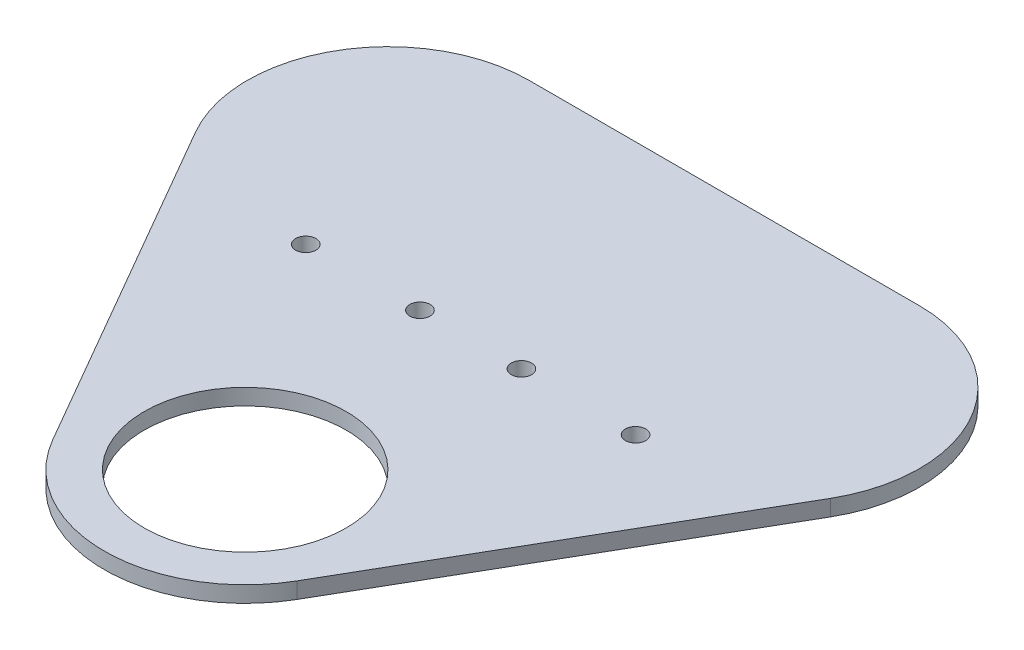
ISO-10303-21;
HEADER;
FILE_DESCRIPTION(('STEP AP214'),'2;1');
FILE_NAME('part.step','',(''),(''),'','','');
FILE_SCHEMA(('AUTOMOTIVE_DESIGN { 1 0 10303 214 1 1 1 1 }'));
ENDSEC;
DATA;
#1=APPLICATION_CONTEXT('core data for automotive mechanical design processes');
#2=APPLICATION_PROTOCOL_DEFINITION('international standard','automotive_design',2000,#1);
#3=PRODUCT_CONTEXT('',#1,'mechanical');
#4=PRODUCT('Part','Part','',(#3));
#5=PRODUCT_RELATED_PRODUCT_CATEGORY('part','',(#4));
#6=PRODUCT_DEFINITION_FORMATION('','',#4);
#7=PRODUCT_DEFINITION_CONTEXT('part definition',#1,'design');
#8=PRODUCT_DEFINITION('design','',#6,#7);
#9=PRODUCT_DEFINITION_SHAPE('','',#8);
#10=(LENGTH_UNIT() NAMED_UNIT(*) SI_UNIT(.MILLI.,.METRE.));
#11=(NAMED_UNIT(*) PLANE_ANGLE_UNIT() SI_UNIT($,.RADIAN.));
#12=(NAMED_UNIT(*) SI_UNIT($,.STERADIAN.) SOLID_ANGLE_UNIT());
#13=UNCERTAINTY_MEASURE_WITH_UNIT(LENGTH_MEASURE(1.E-05),#10,'distance_accuracy_value','');
#14=(GEOMETRIC_REPRESENTATION_CONTEXT(3) GLOBAL_UNCERTAINTY_ASSIGNED_CONTEXT((#13)) GLOBAL_UNIT_ASSIGNED_CONTEXT((#10,
#11,#12)) REPRESENTATION_CONTEXT('',''));
#15=CARTESIAN_POINT('',(0.,0.,0.));
#16=DIRECTION('',(0.,0.,1.));
#17=DIRECTION('',(1.,0.,0.));
#18=AXIS2_PLACEMENT_3D('',#15,#16,#17);
#19=CARTESIAN_POINT('',(86.6025403784437,3.175,-55.0549417933341));
#20=DIRECTION('',(-0.866025403784439,0.,-0.499999999999999));
#21=DIRECTION('',(-0.499999999999999,0.,0.866025403784439));
#22=AXIS2_PLACEMENT_3D('',#19,#20,#21);
#23=PLANE('',#22);
#24=DIRECTION('',(0.499999999999999,0.,-0.866025403784439));
#25=VECTOR('',#24,1.);
#26=CARTESIAN_POINT('',(86.6025403784437,0.,-55.0549417933341));
#27=LINE('',#26,#25);
#28=CARTESIAN_POINT('',(24.0581857171318,0.,53.2750582066658));
#29=VERTEX_POINT('',#28);
#30=CARTESIAN_POINT('',(62.5443546613121,0.,-13.3849417933341));
#31=VERTEX_POINT('',#30);
#32=EDGE_CURVE('E123',#29,#31,#27,.T.);
#33=ORIENTED_EDGE('',*,*,#32,.T.);
#34=DIRECTION('',(0.,-1.,0.));
#35=VECTOR('',#34,1.);
#36=CARTESIAN_POINT('',(62.5443546613121,3.175,-13.3849417933341));
#37=LINE('',#36,#35);
#38=CARTESIAN_POINT('',(62.5443546613121,3.175,-13.3849417933341));
#39=VERTEX_POINT('',#38);
#40=EDGE_CURVE('E99',#31,#39,#37,.F.);
#41=ORIENTED_EDGE('',*,*,#40,.T.);
#42=DIRECTION('',(0.499999999999999,0.,-0.866025403784439));
#43=VECTOR('',#42,1.);
#44=CARTESIAN_POINT('',(86.6025403784437,3.175,-55.0549417933341));
#45=LINE('',#44,#43);
#46=CARTESIAN_POINT('',(24.0581857171318,3.175,53.2750582066658));
#47=VERTEX_POINT('',#46);
#48=EDGE_CURVE('E127',#47,#39,#45,.T.);
#49=ORIENTED_EDGE('',*,*,#48,.F.);
#50=DIRECTION('',(0.,-1.,0.));
#51=VECTOR('',#50,1.);
#52=CARTESIAN_POINT('',(24.0581857171318,3.175,53.2750582066658));
#53=LINE('',#52,#51);
#54=EDGE_CURVE('E105',#47,#29,#53,.T.);
#55=ORIENTED_EDGE('',*,*,#54,.T.);
#56=EDGE_LOOP('',(#33,#41,#49,#55));
#57=FACE_BOUND('',#56,.T.);
#58=ADVANCED_FACE('F39',(#57),#23,.F.);
#59=CARTESIAN_POINT('',(-86.6025403784438,3.175,-55.0549417933341));
#60=DIRECTION('',(0.,0.,1.));
#61=DIRECTION('',(1.,0.,0.));
#62=AXIS2_PLACEMENT_3D('',#59,#60,#61);
#63=PLANE('',#62);
#64=DIRECTION('',(-1.,0.,0.));
#65=VECTOR('',#64,1.);
#66=CARTESIAN_POINT('',(-86.6025403784438,3.175,-55.0549417933341));
#67=LINE('',#66,#65);
#68=CARTESIAN_POINT('',(38.4861689441804,3.175,-55.0549417933341));
#69=VERTEX_POINT('',#68);
#70=CARTESIAN_POINT('',(-38.4861689441804,3.175,-55.0549417933341));
#71=VERTEX_POINT('',#70);
#72=EDGE_CURVE('E114',#69,#71,#67,.T.);
#73=ORIENTED_EDGE('',*,*,#72,.F.);
#74=DIRECTION('',(0.,-1.,0.));
#75=VECTOR('',#74,1.);
#76=CARTESIAN_POINT('',(38.4861689441804,3.175,-55.0549417933341));
#77=LINE('',#76,#75);
#78=CARTESIAN_POINT('',(38.4861689441804,0.,-55.0549417933341));
#79=VERTEX_POINT('',#78);
#80=EDGE_CURVE('E98',#69,#79,#77,.T.);
#81=ORIENTED_EDGE('',*,*,#80,.T.);
#82=DIRECTION('',(-1.,0.,0.));
#83=VECTOR('',#82,1.);
#84=CARTESIAN_POINT('',(-86.6025403784438,0.,-55.0549417933341));
#85=LINE('',#84,#83);
#86=CARTESIAN_POINT('',(-38.4861689441804,0.,-55.0549417933341));
#87=VERTEX_POINT('',#86);
#88=EDGE_CURVE('E112',#79,#87,#85,.T.);
#89=ORIENTED_EDGE('',*,*,#88,.T.);
#90=DIRECTION('',(0.,-1.,0.));
#91=VECTOR('',#90,1.);
#92=CARTESIAN_POINT('',(-38.4861689441804,3.175,-55.0549417933341));
#93=LINE('',#92,#91);
#94=EDGE_CURVE('E117',#87,#71,#93,.F.);
#95=ORIENTED_EDGE('',*,*,#94,.T.);
#96=EDGE_LOOP('',(#73,#81,#89,#95));
#97=FACE_BOUND('',#96,.T.);
#98=ADVANCED_FACE('F111',(#97),#63,.F.);
#99=CARTESIAN_POINT('',(0.,3.175,94.9450582066659));
#100=DIRECTION('',(0.866025403784439,0.,-0.5));
#101=DIRECTION('',(-0.5,0.,-0.866025403784439));
#102=AXIS2_PLACEMENT_3D('',#99,#100,#101);
#103=PLANE('',#102);
#104=DIRECTION('',(0.5,0.,0.866025403784439));
#105=VECTOR('',#104,1.);
#106=CARTESIAN_POINT('',(0.,3.175,94.9450582066659));
#107=LINE('',#106,#105);
#108=CARTESIAN_POINT('',(-62.5443546613121,3.175,-13.3849417933341));
#109=VERTEX_POINT('',#108);
#110=CARTESIAN_POINT('',(-24.0581857171317,3.175,53.2750582066658));
#111=VERTEX_POINT('',#110);
#112=EDGE_CURVE('E134',#109,#111,#107,.T.);
#113=ORIENTED_EDGE('',*,*,#112,.F.);
#114=DIRECTION('',(0.,-1.,0.));
#115=VECTOR('',#114,1.);
#116=CARTESIAN_POINT('',(-62.5443546613121,3.175,-13.3849417933341));
#117=LINE('',#116,#115);
#118=CARTESIAN_POINT('',(-62.5443546613121,0.,-13.3849417933341));
#119=VERTEX_POINT('',#118);
#120=EDGE_CURVE('E11',#109,#119,#117,.T.);
#121=ORIENTED_EDGE('',*,*,#120,.T.);
#122=DIRECTION('',(0.5,0.,0.866025403784439));
#123=VECTOR('',#122,1.);
#124=CARTESIAN_POINT('',(0.,0.,94.9450582066659));
#125=LINE('',#124,#123);
#126=CARTESIAN_POINT('',(-24.0581857171317,0.,53.2750582066658));
#127=VERTEX_POINT('',#126);
#128=EDGE_CURVE('E122',#119,#127,#125,.T.);
#129=ORIENTED_EDGE('',*,*,#128,.T.);
#130=DIRECTION('',(0.,-1.,0.));
#131=VECTOR('',#130,1.);
#132=CARTESIAN_POINT('',(-24.0581857171317,3.175,53.2750582066658));
#133=LINE('',#132,#131);
#134=EDGE_CURVE('E48',#127,#111,#133,.F.);
#135=ORIENTED_EDGE('',*,*,#134,.T.);
#136=EDGE_LOOP('',(#113,#121,#129,#135));
#137=FACE_BOUND('',#136,.T.);
#138=ADVANCED_FACE('F213',(#137),#103,.F.);
#139=CARTESIAN_POINT('',(0.,3.175,0.));
#140=DIRECTION('',(0.,-1.,0.));
#141=DIRECTION('',(0.,0.,-1.));
#142=AXIS2_PLACEMENT_3D('',#139,#140,#141);
#143=PLANE('',#142);
#144=CARTESIAN_POINT('',(0.,3.175,39.3850582066658));
#145=DIRECTION('',(0.,1.,0.));
#146=DIRECTION('',(0.,0.,1.));
#147=AXIS2_PLACEMENT_3D('',#144,#145,#146);
#148=CIRCLE('',#147,19.9);
#149=CARTESIAN_POINT('',(0.,3.175,59.2850582066658));
#150=VERTEX_POINT('',#149);
#151=EDGE_CURVE('E193',#150,#150,#148,.T.);
#152=ORIENTED_EDGE('',*,*,#151,.F.);
#153=EDGE_LOOP('',(#152));
#154=FACE_BOUND('',#153,.T.);
#155=CARTESIAN_POINT('',(32.5,3.175,-5.0549417933341));
#156=DIRECTION('',(0.,1.,0.));
#157=DIRECTION('',(0.,0.,1.));
#158=AXIS2_PLACEMENT_3D('',#155,#156,#157);
#159=CIRCLE('',#158,2.);
#160=CARTESIAN_POINT('',(32.5,3.175,-3.0549417933341));
#161=VERTEX_POINT('',#160);
#162=EDGE_CURVE('E186',#161,#161,#159,.T.);
#163=ORIENTED_EDGE('',*,*,#162,.F.);
#164=EDGE_LOOP('',(#163));
#165=FACE_BOUND('',#164,.T.);
#166=CARTESIAN_POINT('',(-32.5,3.175,-5.0549417933341));
#167=DIRECTION('',(0.,1.,0.));
#168=DIRECTION('',(0.,0.,1.));
#169=AXIS2_PLACEMENT_3D('',#166,#167,#168);
#170=CIRCLE('',#169,2.);
#171=CARTESIAN_POINT('',(-32.5,3.175,-3.0549417933341));
#172=VERTEX_POINT('',#171);
#173=EDGE_CURVE('E178',#172,#172,#170,.T.);
#174=ORIENTED_EDGE('',*,*,#173,.F.);
#175=EDGE_LOOP('',(#174));
#176=FACE_BOUND('',#175,.T.);
#177=CARTESIAN_POINT('',(-10.,3.175,-5.0549417933341));
#178=DIRECTION('',(0.,1.,0.));
#179=DIRECTION('',(0.,0.,1.));
#180=AXIS2_PLACEMENT_3D('',#177,#178,#179);
#181=CIRCLE('',#180,2.);
#182=CARTESIAN_POINT('',(-10.,3.175,-3.0549417933341));
#183=VERTEX_POINT('',#182);
#184=EDGE_CURVE('E170',#183,#183,#181,.T.);
#185=ORIENTED_EDGE('',*,*,#184,.F.);
#186=EDGE_LOOP('',(#185));
#187=FACE_BOUND('',#186,.T.);
#188=CARTESIAN_POINT('',(10.,3.175,-5.0549417933341));
#189=DIRECTION('',(0.,1.,0.));
#190=DIRECTION('',(0.,0.,1.));
#191=AXIS2_PLACEMENT_3D('',#188,#189,#190);
#192=CIRCLE('',#191,2.);
#193=CARTESIAN_POINT('',(10.,3.175,-3.0549417933341));
#194=VERTEX_POINT('',#193);
#195=EDGE_CURVE('E161',#194,#194,#192,.T.);
#196=ORIENTED_EDGE('',*,*,#195,.F.);
#197=EDGE_LOOP('',(#196));
#198=FACE_BOUND('',#197,.T.);
#199=ORIENTED_EDGE('',*,*,#48,.T.);
#200=CARTESIAN_POINT('',(38.4861689441804,3.175,-27.2749417933341));
#201=DIRECTION('',(0.,-1.,0.));
#202=DIRECTION('',(0.,0.,-1.));
#203=AXIS2_PLACEMENT_3D('',#200,#201,#202);
#204=CIRCLE('',#203,27.78);
#205=EDGE_CURVE('E150',#39,#69,#204,.F.);
#206=ORIENTED_EDGE('',*,*,#205,.T.);
#207=ORIENTED_EDGE('',*,*,#72,.T.);
#208=CARTESIAN_POINT('',(-38.4861689441804,3.175,-27.2749417933341));
#209=DIRECTION('',(0.,-1.,0.));
#210=DIRECTION('',(0.,0.,-1.));
#211=AXIS2_PLACEMENT_3D('',#208,#209,#210);
#212=CIRCLE('',#211,27.78);
#213=EDGE_CURVE('E61',#71,#109,#212,.F.);
#214=ORIENTED_EDGE('',*,*,#213,.T.);
#215=ORIENTED_EDGE('',*,*,#112,.T.);
#216=CARTESIAN_POINT('',(0.,3.175,39.3850582066658));
#217=DIRECTION('',(0.,-1.,0.));
#218=DIRECTION('',(0.,0.,-1.));
#219=AXIS2_PLACEMENT_3D('',#216,#217,#218);
#220=CIRCLE('',#219,27.78);
#221=EDGE_CURVE('E145',#111,#47,#220,.F.);
#222=ORIENTED_EDGE('',*,*,#221,.T.);
#223=EDGE_LOOP('',(#199,#206,#207,#214,#215,#222));
#224=FACE_BOUND('',#223,.T.);
#225=ADVANCED_FACE('F210',(#154,#165,#176,#187,#198,#224),#143,.F.);
#226=CARTESIAN_POINT('',(0.,0.,0.));
#227=DIRECTION('',(0.,-1.,0.));
#228=DIRECTION('',(0.,0.,-1.));
#229=AXIS2_PLACEMENT_3D('',#226,#227,#228);
#230=PLANE('',#229);
#231=CARTESIAN_POINT('',(0.,0.,39.3850582066658));
#232=DIRECTION('',(0.,1.,0.));
#233=DIRECTION('',(0.,0.,1.));
#234=AXIS2_PLACEMENT_3D('',#231,#232,#233);
#235=CIRCLE('',#234,19.9);
#236=CARTESIAN_POINT('',(0.,0.,59.2850582066658));
#237=VERTEX_POINT('',#236);
#238=EDGE_CURVE('E166',#237,#237,#235,.T.);
#239=ORIENTED_EDGE('',*,*,#238,.T.);
#240=EDGE_LOOP('',(#239));
#241=FACE_BOUND('',#240,.T.);
#242=CARTESIAN_POINT('',(32.5,0.,-5.0549417933341));
#243=DIRECTION('',(0.,1.,0.));
#244=DIRECTION('',(0.,0.,1.));
#245=AXIS2_PLACEMENT_3D('',#242,#243,#244);
#246=CIRCLE('',#245,2.);
#247=CARTESIAN_POINT('',(32.5,0.,-3.0549417933341));
#248=VERTEX_POINT('',#247);
#249=EDGE_CURVE('E129',#248,#248,#246,.T.);
#250=ORIENTED_EDGE('',*,*,#249,.T.);
#251=EDGE_LOOP('',(#250));
#252=FACE_BOUND('',#251,.T.);
#253=CARTESIAN_POINT('',(-32.5,0.,-5.0549417933341));
#254=DIRECTION('',(0.,1.,0.));
#255=DIRECTION('',(0.,0.,1.));
#256=AXIS2_PLACEMENT_3D('',#253,#254,#255);
#257=CIRCLE('',#256,2.);
#258=CARTESIAN_POINT('',(-32.5,0.,-3.0549417933341));
#259=VERTEX_POINT('',#258);
#260=EDGE_CURVE('E182',#259,#259,#257,.T.);
#261=ORIENTED_EDGE('',*,*,#260,.T.);
#262=EDGE_LOOP('',(#261));
#263=FACE_BOUND('',#262,.T.);
#264=CARTESIAN_POINT('',(-10.,0.,-5.0549417933341));
#265=DIRECTION('',(0.,1.,0.));
#266=DIRECTION('',(0.,0.,1.));
#267=AXIS2_PLACEMENT_3D('',#264,#265,#266);
#268=CIRCLE('',#267,2.);
#269=CARTESIAN_POINT('',(-10.,0.,-3.0549417933341));
#270=VERTEX_POINT('',#269);
#271=EDGE_CURVE('E174',#270,#270,#268,.T.);
#272=ORIENTED_EDGE('',*,*,#271,.T.);
#273=EDGE_LOOP('',(#272));
#274=FACE_BOUND('',#273,.T.);
#275=CARTESIAN_POINT('',(10.,0.,-5.0549417933341));
#276=DIRECTION('',(0.,1.,0.));
#277=DIRECTION('',(0.,0.,1.));
#278=AXIS2_PLACEMENT_3D('',#275,#276,#277);
#279=CIRCLE('',#278,2.);
#280=CARTESIAN_POINT('',(10.,0.,-3.0549417933341));
#281=VERTEX_POINT('',#280);
#282=EDGE_CURVE('E165',#281,#281,#279,.T.);
#283=ORIENTED_EDGE('',*,*,#282,.T.);
#284=EDGE_LOOP('',(#283));
#285=FACE_BOUND('',#284,.T.);
#286=ORIENTED_EDGE('',*,*,#88,.F.);
#287=CARTESIAN_POINT('',(38.4861689441804,0.,-27.2749417933341));
#288=DIRECTION('',(0.,-1.,0.));
#289=DIRECTION('',(0.,0.,-1.));
#290=AXIS2_PLACEMENT_3D('',#287,#288,#289);
#291=CIRCLE('',#290,27.78);
#292=EDGE_CURVE('E94',#79,#31,#291,.T.);
#293=ORIENTED_EDGE('',*,*,#292,.T.);
#294=ORIENTED_EDGE('',*,*,#32,.F.);
#295=CARTESIAN_POINT('',(0.,0.,39.3850582066658));
#296=DIRECTION('',(0.,-1.,0.));
#297=DIRECTION('',(0.,0.,-1.));
#298=AXIS2_PLACEMENT_3D('',#295,#296,#297);
#299=CIRCLE('',#298,27.78);
#300=EDGE_CURVE('E116',#29,#127,#299,.T.);
#301=ORIENTED_EDGE('',*,*,#300,.T.);
#302=ORIENTED_EDGE('',*,*,#128,.F.);
#303=CARTESIAN_POINT('',(-38.4861689441804,0.,-27.2749417933341));
#304=DIRECTION('',(0.,-1.,0.));
#305=DIRECTION('',(0.,0.,-1.));
#306=AXIS2_PLACEMENT_3D('',#303,#304,#305);
#307=CIRCLE('',#306,27.78);
#308=EDGE_CURVE('E106',#119,#87,#307,.T.);
#309=ORIENTED_EDGE('',*,*,#308,.T.);
#310=EDGE_LOOP('',(#286,#293,#294,#301,#302,#309));
#311=FACE_BOUND('',#310,.T.);
#312=ADVANCED_FACE('F119',(#241,#252,#263,#274,#285,#311),#230,.T.);
#313=CARTESIAN_POINT('',(38.4861689441804,3.175,-27.2749417933341));
#314=DIRECTION('',(0.,-1.,0.));
#315=DIRECTION('',(0.,0.,-1.));
#316=AXIS2_PLACEMENT_3D('',#313,#314,#315);
#317=CYLINDRICAL_SURFACE('',#316,27.78);
#318=ORIENTED_EDGE('',*,*,#205,.F.);
#319=ORIENTED_EDGE('',*,*,#40,.F.);
#320=ORIENTED_EDGE('',*,*,#292,.F.);
#321=ORIENTED_EDGE('',*,*,#80,.F.);
#322=EDGE_LOOP('',(#318,#319,#320,#321));
#323=FACE_BOUND('',#322,.T.);
#324=ADVANCED_FACE('F97',(#323),#317,.T.);
#325=CARTESIAN_POINT('',(-38.4861689441804,3.175,-27.2749417933341));
#326=DIRECTION('',(0.,-1.,0.));
#327=DIRECTION('',(0.,0.,-1.));
#328=AXIS2_PLACEMENT_3D('',#325,#326,#327);
#329=CYLINDRICAL_SURFACE('',#328,27.78);
#330=ORIENTED_EDGE('',*,*,#213,.F.);
#331=ORIENTED_EDGE('',*,*,#94,.F.);
#332=ORIENTED_EDGE('',*,*,#308,.F.);
#333=ORIENTED_EDGE('',*,*,#120,.F.);
#334=EDGE_LOOP('',(#330,#331,#332,#333));
#335=FACE_BOUND('',#334,.T.);
#336=ADVANCED_FACE('F235',(#335),#329,.T.);
#337=CARTESIAN_POINT('',(0.,3.175,39.3850582066658));
#338=DIRECTION('',(0.,-1.,0.));
#339=DIRECTION('',(0.,0.,-1.));
#340=AXIS2_PLACEMENT_3D('',#337,#338,#339);
#341=CYLINDRICAL_SURFACE('',#340,27.78);
#342=ORIENTED_EDGE('',*,*,#221,.F.);
#343=ORIENTED_EDGE('',*,*,#134,.F.);
#344=ORIENTED_EDGE('',*,*,#300,.F.);
#345=ORIENTED_EDGE('',*,*,#54,.F.);
#346=EDGE_LOOP('',(#342,#343,#344,#345));
#347=FACE_BOUND('',#346,.T.);
#348=ADVANCED_FACE('F41',(#347),#341,.T.);
#349=CARTESIAN_POINT('',(10.,0.,-5.0549417933341));
#350=DIRECTION('',(0.,1.,0.));
#351=DIRECTION('',(0.,0.,1.));
#352=AXIS2_PLACEMENT_3D('',#349,#350,#351);
#353=CYLINDRICAL_SURFACE('',#352,2.);
#354=ORIENTED_EDGE('',*,*,#282,.F.);
#355=EDGE_LOOP('',(#354));
#356=FACE_BOUND('',#355,.T.);
#357=ORIENTED_EDGE('',*,*,#195,.T.);
#358=EDGE_LOOP('',(#357));
#359=FACE_BOUND('',#358,.T.);
#360=ADVANCED_FACE('F223',(#356,#359),#353,.F.);
#361=CARTESIAN_POINT('',(-10.,0.,-5.0549417933341));
#362=DIRECTION('',(0.,1.,0.));
#363=DIRECTION('',(0.,0.,1.));
#364=AXIS2_PLACEMENT_3D('',#361,#362,#363);
#365=CYLINDRICAL_SURFACE('',#364,2.);
#366=ORIENTED_EDGE('',*,*,#271,.F.);
#367=EDGE_LOOP('',(#366));
#368=FACE_BOUND('',#367,.T.);
#369=ORIENTED_EDGE('',*,*,#184,.T.);
#370=EDGE_LOOP('',(#369));
#371=FACE_BOUND('',#370,.T.);
#372=ADVANCED_FACE('F225',(#368,#371),#365,.F.);
#373=CARTESIAN_POINT('',(-32.5,0.,-5.0549417933341));
#374=DIRECTION('',(0.,1.,0.));
#375=DIRECTION('',(0.,0.,1.));
#376=AXIS2_PLACEMENT_3D('',#373,#374,#375);
#377=CYLINDRICAL_SURFACE('',#376,2.);
#378=ORIENTED_EDGE('',*,*,#260,.F.);
#379=EDGE_LOOP('',(#378));
#380=FACE_BOUND('',#379,.T.);
#381=ORIENTED_EDGE('',*,*,#173,.T.);
#382=EDGE_LOOP('',(#381));
#383=FACE_BOUND('',#382,.T.);
#384=ADVANCED_FACE('F232',(#380,#383),#377,.F.);
#385=CARTESIAN_POINT('',(32.5,0.,-5.0549417933341));
#386=DIRECTION('',(0.,1.,0.));
#387=DIRECTION('',(0.,0.,1.));
#388=AXIS2_PLACEMENT_3D('',#385,#386,#387);
#389=CYLINDRICAL_SURFACE('',#388,2.);
#390=ORIENTED_EDGE('',*,*,#249,.F.);
#391=EDGE_LOOP('',(#390));
#392=FACE_BOUND('',#391,.T.);
#393=ORIENTED_EDGE('',*,*,#162,.T.);
#394=EDGE_LOOP('',(#393));
#395=FACE_BOUND('',#394,.T.);
#396=ADVANCED_FACE('F206',(#392,#395),#389,.F.);
#397=CARTESIAN_POINT('',(0.,0.,39.3850582066658));
#398=DIRECTION('',(0.,1.,0.));
#399=DIRECTION('',(0.,0.,1.));
#400=AXIS2_PLACEMENT_3D('',#397,#398,#399);
#401=CYLINDRICAL_SURFACE('',#400,19.9);
#402=ORIENTED_EDGE('',*,*,#238,.F.);
#403=EDGE_LOOP('',(#402));
#404=FACE_BOUND('',#403,.T.);
#405=ORIENTED_EDGE('',*,*,#151,.T.);
#406=EDGE_LOOP('',(#405));
#407=FACE_BOUND('',#406,.T.);
#408=ADVANCED_FACE('F203',(#404,#407),#401,.F.);
#409=CLOSED_SHELL('',(#58,#98,#138,#225,#312,#324,#336,#348,#360,#372,#384,#396,#408));
#410=MANIFOLD_SOLID_BREP('B2',#409);
#411=ADVANCED_BREP_SHAPE_REPRESENTATION('',(#18,#410),#14);
#412=SHAPE_DEFINITION_REPRESENTATION(#9,#411);
ENDSEC;
END-ISO-10303-21;
